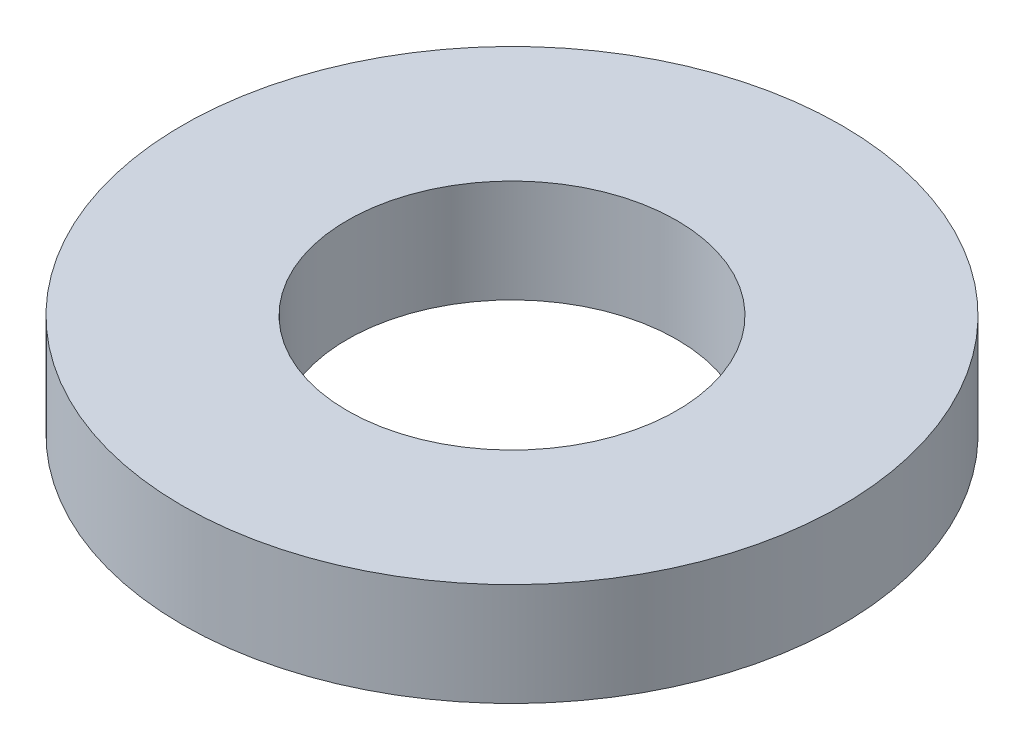
ISO-10303-21;
HEADER;
FILE_DESCRIPTION(('STEP AP214'),'2;1');
FILE_NAME('part.step','',(''),(''),'','','');
FILE_SCHEMA(('AUTOMOTIVE_DESIGN { 1 0 10303 214 1 1 1 1 }'));
ENDSEC;
DATA;
#1=APPLICATION_CONTEXT('core data for automotive mechanical design processes');
#2=APPLICATION_PROTOCOL_DEFINITION('international standard','automotive_design',2000,#1);
#3=PRODUCT_CONTEXT('',#1,'mechanical');
#4=PRODUCT('Part','Part','',(#3));
#5=PRODUCT_RELATED_PRODUCT_CATEGORY('part','',(#4));
#6=PRODUCT_DEFINITION_FORMATION('','',#4);
#7=PRODUCT_DEFINITION_CONTEXT('part definition',#1,'design');
#8=PRODUCT_DEFINITION('design','',#6,#7);
#9=PRODUCT_DEFINITION_SHAPE('','',#8);
#10=(LENGTH_UNIT() NAMED_UNIT(*) SI_UNIT(.MILLI.,.METRE.));
#11=(NAMED_UNIT(*) PLANE_ANGLE_UNIT() SI_UNIT($,.RADIAN.));
#12=(NAMED_UNIT(*) SI_UNIT($,.STERADIAN.) SOLID_ANGLE_UNIT());
#13=UNCERTAINTY_MEASURE_WITH_UNIT(LENGTH_MEASURE(1.E-05),#10,'distance_accuracy_value','');
#14=(GEOMETRIC_REPRESENTATION_CONTEXT(3) GLOBAL_UNCERTAINTY_ASSIGNED_CONTEXT((#13)) GLOBAL_UNIT_ASSIGNED_CONTEXT((#10,
#11,#12)) REPRESENTATION_CONTEXT('',''));
#15=CARTESIAN_POINT('',(0.,0.,0.));
#16=DIRECTION('',(0.,0.,1.));
#17=DIRECTION('',(1.,0.,0.));
#18=AXIS2_PLACEMENT_3D('',#15,#16,#17);
#19=CARTESIAN_POINT('',(0.,2.5,0.));
#20=DIRECTION('',(0.,1.,0.));
#21=DIRECTION('',(0.,0.,1.));
#22=AXIS2_PLACEMENT_3D('',#19,#20,#21);
#23=PLANE('',#22);
#24=CARTESIAN_POINT('',(0.,2.5,0.));
#25=DIRECTION('',(0.,1.,0.));
#26=DIRECTION('',(0.,0.,1.));
#27=AXIS2_PLACEMENT_3D('',#24,#25,#26);
#28=CIRCLE('',#27,8.);
#29=CARTESIAN_POINT('',(0.,2.5,8.));
#30=VERTEX_POINT('',#29);
#31=EDGE_CURVE('E10',#30,#30,#28,.T.);
#32=ORIENTED_EDGE('',*,*,#31,.T.);
#33=EDGE_LOOP('',(#32));
#34=FACE_BOUND('',#33,.T.);
#35=CARTESIAN_POINT('',(0.,2.5,0.));
#36=DIRECTION('',(0.,1.,0.));
#37=DIRECTION('',(0.,0.,1.));
#38=AXIS2_PLACEMENT_3D('',#35,#36,#37);
#39=CIRCLE('',#38,4.);
#40=CARTESIAN_POINT('',(0.,2.5,4.));
#41=VERTEX_POINT('',#40);
#42=EDGE_CURVE('E50',#41,#41,#39,.T.);
#43=ORIENTED_EDGE('',*,*,#42,.F.);
#44=EDGE_LOOP('',(#43));
#45=FACE_BOUND('',#44,.T.);
#46=ADVANCED_FACE('F37',(#34,#45),#23,.T.);
#47=CARTESIAN_POINT('',(0.,0.,0.));
#48=DIRECTION('',(0.,1.,0.));
#49=DIRECTION('',(0.,0.,1.));
#50=AXIS2_PLACEMENT_3D('',#47,#48,#49);
#51=PLANE('',#50);
#52=CARTESIAN_POINT('',(0.,0.,0.));
#53=DIRECTION('',(0.,1.,0.));
#54=DIRECTION('',(0.,0.,1.));
#55=AXIS2_PLACEMENT_3D('',#52,#53,#54);
#56=CIRCLE('',#55,8.);
#57=CARTESIAN_POINT('',(0.,0.,8.));
#58=VERTEX_POINT('',#57);
#59=EDGE_CURVE('E41',#58,#58,#56,.T.);
#60=ORIENTED_EDGE('',*,*,#59,.F.);
#61=EDGE_LOOP('',(#60));
#62=FACE_BOUND('',#61,.T.);
#63=CARTESIAN_POINT('',(0.,0.,0.));
#64=DIRECTION('',(0.,1.,0.));
#65=DIRECTION('',(0.,0.,1.));
#66=AXIS2_PLACEMENT_3D('',#63,#64,#65);
#67=CIRCLE('',#66,4.);
#68=CARTESIAN_POINT('',(0.,0.,4.));
#69=VERTEX_POINT('',#68);
#70=EDGE_CURVE('E52',#69,#69,#67,.T.);
#71=ORIENTED_EDGE('',*,*,#70,.T.);
#72=EDGE_LOOP('',(#71));
#73=FACE_BOUND('',#72,.T.);
#74=ADVANCED_FACE('F64',(#62,#73),#51,.F.);
#75=CARTESIAN_POINT('',(0.,2.5,0.));
#76=DIRECTION('',(0.,-1.,0.));
#77=DIRECTION('',(0.,0.,-1.));
#78=AXIS2_PLACEMENT_3D('',#75,#76,#77);
#79=CYLINDRICAL_SURFACE('',#78,8.);
#80=ORIENTED_EDGE('',*,*,#31,.F.);
#81=EDGE_LOOP('',(#80));
#82=FACE_BOUND('',#81,.T.);
#83=ORIENTED_EDGE('',*,*,#59,.T.);
#84=EDGE_LOOP('',(#83));
#85=FACE_BOUND('',#84,.T.);
#86=ADVANCED_FACE('F39',(#82,#85),#79,.T.);
#87=CARTESIAN_POINT('',(0.,2.5,0.));
#88=DIRECTION('',(0.,-1.,0.));
#89=DIRECTION('',(0.,0.,-1.));
#90=AXIS2_PLACEMENT_3D('',#87,#88,#89);
#91=CYLINDRICAL_SURFACE('',#90,4.);
#92=ORIENTED_EDGE('',*,*,#42,.T.);
#93=EDGE_LOOP('',(#92));
#94=FACE_BOUND('',#93,.T.);
#95=ORIENTED_EDGE('',*,*,#70,.F.);
#96=EDGE_LOOP('',(#95));
#97=FACE_BOUND('',#96,.T.);
#98=ADVANCED_FACE('F60',(#94,#97),#91,.F.);
#99=CLOSED_SHELL('',(#46,#74,#86,#98));
#100=MANIFOLD_SOLID_BREP('B2',#99);
#101=ADVANCED_BREP_SHAPE_REPRESENTATION('',(#18,#100),#14);
#102=SHAPE_DEFINITION_REPRESENTATION(#9,#101);
ENDSEC;
END-ISO-10303-21;
